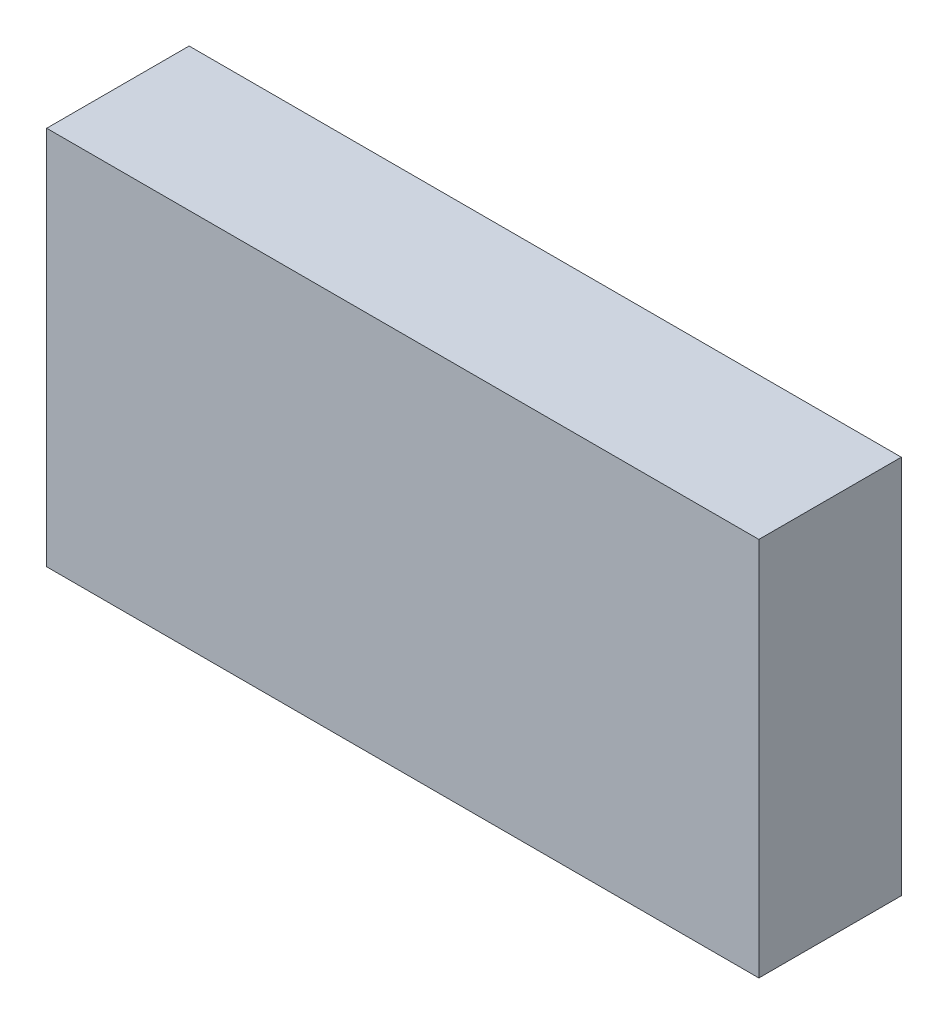
ISO-10303-21;
HEADER;
FILE_DESCRIPTION(('STEP AP214'),'2;1');
FILE_NAME('part.step','',(''),(''),'','','');
FILE_SCHEMA(('AUTOMOTIVE_DESIGN { 1 0 10303 214 1 1 1 1 }'));
ENDSEC;
DATA;
#1=APPLICATION_CONTEXT('core data for automotive mechanical design processes');
#2=APPLICATION_PROTOCOL_DEFINITION('international standard','automotive_design',2000,#1);
#3=PRODUCT_CONTEXT('',#1,'mechanical');
#4=PRODUCT('Part','Part','',(#3));
#5=PRODUCT_RELATED_PRODUCT_CATEGORY('part','',(#4));
#6=PRODUCT_DEFINITION_FORMATION('','',#4);
#7=PRODUCT_DEFINITION_CONTEXT('part definition',#1,'design');
#8=PRODUCT_DEFINITION('design','',#6,#7);
#9=PRODUCT_DEFINITION_SHAPE('','',#8);
#10=(LENGTH_UNIT() NAMED_UNIT(*) SI_UNIT(.MILLI.,.METRE.));
#11=(NAMED_UNIT(*) PLANE_ANGLE_UNIT() SI_UNIT($,.RADIAN.));
#12=(NAMED_UNIT(*) SI_UNIT($,.STERADIAN.) SOLID_ANGLE_UNIT());
#13=UNCERTAINTY_MEASURE_WITH_UNIT(LENGTH_MEASURE(1.E-05),#10,'distance_accuracy_value','');
#14=(GEOMETRIC_REPRESENTATION_CONTEXT(3) GLOBAL_UNCERTAINTY_ASSIGNED_CONTEXT((#13)) GLOBAL_UNIT_ASSIGNED_CONTEXT((#10,
#11,#12)) REPRESENTATION_CONTEXT('',''));
#15=CARTESIAN_POINT('',(0.,0.,0.));
#16=DIRECTION('',(0.,0.,1.));
#17=DIRECTION('',(1.,0.,0.));
#18=AXIS2_PLACEMENT_3D('',#15,#16,#17);
#19=CARTESIAN_POINT('',(596.,73.,-3.));
#20=DIRECTION('',(-1.,0.,0.));
#21=DIRECTION('',(0.,0.,1.));
#22=AXIS2_PLACEMENT_3D('',#19,#20,#21);
#23=PLANE('',#22);
#24=DIRECTION('',(0.,-1.,0.));
#25=VECTOR('',#24,1.);
#26=CARTESIAN_POINT('',(596.,73.,0.));
#27=LINE('',#26,#25);
#28=CARTESIAN_POINT('',(596.,81.,0.));
#29=VERTEX_POINT('',#28);
#30=CARTESIAN_POINT('',(596.,73.,0.));
#31=VERTEX_POINT('',#30);
#32=EDGE_CURVE('E103',#29,#31,#27,.T.);
#33=ORIENTED_EDGE('',*,*,#32,.F.);
#34=DIRECTION('',(0.,0.,1.));
#35=VECTOR('',#34,1.);
#36=CARTESIAN_POINT('',(596.,81.,-3.));
#37=LINE('',#36,#35);
#38=CARTESIAN_POINT('',(596.,81.,-3.));
#39=VERTEX_POINT('',#38);
#40=EDGE_CURVE('E11',#39,#29,#37,.T.);
#41=ORIENTED_EDGE('',*,*,#40,.F.);
#42=DIRECTION('',(0.,-1.,0.));
#43=VECTOR('',#42,1.);
#44=CARTESIAN_POINT('',(596.,73.,-3.));
#45=LINE('',#44,#43);
#46=CARTESIAN_POINT('',(596.,73.,-3.));
#47=VERTEX_POINT('',#46);
#48=EDGE_CURVE('E97',#39,#47,#45,.T.);
#49=ORIENTED_EDGE('',*,*,#48,.T.);
#50=DIRECTION('',(0.,0.,1.));
#51=VECTOR('',#50,1.);
#52=CARTESIAN_POINT('',(596.,73.,-3.));
#53=LINE('',#52,#51);
#54=EDGE_CURVE('E42',#47,#31,#53,.T.);
#55=ORIENTED_EDGE('',*,*,#54,.T.);
#56=EDGE_LOOP('',(#33,#41,#49,#55));
#57=FACE_BOUND('',#56,.T.);
#58=ADVANCED_FACE('F39',(#57),#23,.T.);
#59=CARTESIAN_POINT('',(596.,81.,-3.));
#60=DIRECTION('',(0.,1.,0.));
#61=DIRECTION('',(0.,0.,1.));
#62=AXIS2_PLACEMENT_3D('',#59,#60,#61);
#63=PLANE('',#62);
#64=DIRECTION('',(-1.,0.,0.));
#65=VECTOR('',#64,1.);
#66=CARTESIAN_POINT('',(596.,81.,0.));
#67=LINE('',#66,#65);
#68=CARTESIAN_POINT('',(611.,81.,0.));
#69=VERTEX_POINT('',#68);
#70=EDGE_CURVE('E99',#69,#29,#67,.T.);
#71=ORIENTED_EDGE('',*,*,#70,.F.);
#72=DIRECTION('',(0.,0.,1.));
#73=VECTOR('',#72,1.);
#74=CARTESIAN_POINT('',(611.,81.,-3.));
#75=LINE('',#74,#73);
#76=CARTESIAN_POINT('',(611.,81.,-3.));
#77=VERTEX_POINT('',#76);
#78=EDGE_CURVE('E48',#77,#69,#75,.T.);
#79=ORIENTED_EDGE('',*,*,#78,.F.);
#80=DIRECTION('',(-1.,0.,0.));
#81=VECTOR('',#80,1.);
#82=CARTESIAN_POINT('',(596.,81.,-3.));
#83=LINE('',#82,#81);
#84=EDGE_CURVE('E94',#77,#39,#83,.T.);
#85=ORIENTED_EDGE('',*,*,#84,.T.);
#86=ORIENTED_EDGE('',*,*,#40,.T.);
#87=EDGE_LOOP('',(#71,#79,#85,#86));
#88=FACE_BOUND('',#87,.T.);
#89=ADVANCED_FACE('F113',(#88),#63,.T.);
#90=CARTESIAN_POINT('',(611.,73.,-3.));
#91=DIRECTION('',(1.,0.,0.));
#92=DIRECTION('',(0.,0.,-1.));
#93=AXIS2_PLACEMENT_3D('',#90,#91,#92);
#94=PLANE('',#93);
#95=DIRECTION('',(0.,1.,0.));
#96=VECTOR('',#95,1.);
#97=CARTESIAN_POINT('',(611.,73.,0.));
#98=LINE('',#97,#96);
#99=CARTESIAN_POINT('',(611.,73.,0.));
#100=VERTEX_POINT('',#99);
#101=EDGE_CURVE('E89',#100,#69,#98,.T.);
#102=ORIENTED_EDGE('',*,*,#101,.F.);
#103=DIRECTION('',(0.,0.,1.));
#104=VECTOR('',#103,1.);
#105=CARTESIAN_POINT('',(611.,73.,-3.));
#106=LINE('',#105,#104);
#107=CARTESIAN_POINT('',(611.,73.,-3.));
#108=VERTEX_POINT('',#107);
#109=EDGE_CURVE('E84',#108,#100,#106,.T.);
#110=ORIENTED_EDGE('',*,*,#109,.F.);
#111=DIRECTION('',(0.,1.,0.));
#112=VECTOR('',#111,1.);
#113=CARTESIAN_POINT('',(611.,73.,-3.));
#114=LINE('',#113,#112);
#115=EDGE_CURVE('E87',#108,#77,#114,.T.);
#116=ORIENTED_EDGE('',*,*,#115,.T.);
#117=ORIENTED_EDGE('',*,*,#78,.T.);
#118=EDGE_LOOP('',(#102,#110,#116,#117));
#119=FACE_BOUND('',#118,.T.);
#120=ADVANCED_FACE('F86',(#119),#94,.T.);
#121=CARTESIAN_POINT('',(596.,73.,-3.));
#122=DIRECTION('',(0.,-1.,0.));
#123=DIRECTION('',(0.,0.,-1.));
#124=AXIS2_PLACEMENT_3D('',#121,#122,#123);
#125=PLANE('',#124);
#126=DIRECTION('',(1.,0.,0.));
#127=VECTOR('',#126,1.);
#128=CARTESIAN_POINT('',(596.,73.,0.));
#129=LINE('',#128,#127);
#130=EDGE_CURVE('E106',#31,#100,#129,.T.);
#131=ORIENTED_EDGE('',*,*,#130,.F.);
#132=ORIENTED_EDGE('',*,*,#54,.F.);
#133=DIRECTION('',(1.,0.,0.));
#134=VECTOR('',#133,1.);
#135=CARTESIAN_POINT('',(596.,73.,-3.));
#136=LINE('',#135,#134);
#137=EDGE_CURVE('E93',#47,#108,#136,.T.);
#138=ORIENTED_EDGE('',*,*,#137,.T.);
#139=ORIENTED_EDGE('',*,*,#109,.T.);
#140=EDGE_LOOP('',(#131,#132,#138,#139));
#141=FACE_BOUND('',#140,.T.);
#142=ADVANCED_FACE('F96',(#141),#125,.T.);
#143=CARTESIAN_POINT('',(0.,0.,-3.));
#144=DIRECTION('',(0.,0.,-1.));
#145=DIRECTION('',(-1.,0.,0.));
#146=AXIS2_PLACEMENT_3D('',#143,#144,#145);
#147=PLANE('',#146);
#148=ORIENTED_EDGE('',*,*,#48,.F.);
#149=ORIENTED_EDGE('',*,*,#84,.F.);
#150=ORIENTED_EDGE('',*,*,#115,.F.);
#151=ORIENTED_EDGE('',*,*,#137,.F.);
#152=EDGE_LOOP('',(#148,#149,#150,#151));
#153=FACE_BOUND('',#152,.T.);
#154=ADVANCED_FACE('F92',(#153),#147,.T.);
#155=CARTESIAN_POINT('',(0.,0.,0.));
#156=DIRECTION('',(0.,0.,-1.));
#157=DIRECTION('',(-1.,0.,0.));
#158=AXIS2_PLACEMENT_3D('',#155,#156,#157);
#159=PLANE('',#158);
#160=ORIENTED_EDGE('',*,*,#32,.T.);
#161=ORIENTED_EDGE('',*,*,#130,.T.);
#162=ORIENTED_EDGE('',*,*,#101,.T.);
#163=ORIENTED_EDGE('',*,*,#70,.T.);
#164=EDGE_LOOP('',(#160,#161,#162,#163));
#165=FACE_BOUND('',#164,.T.);
#166=ADVANCED_FACE('F112',(#165),#159,.F.);
#167=CLOSED_SHELL('',(#58,#89,#120,#142,#154,#166));
#168=MANIFOLD_SOLID_BREP('B2',#167);
#169=ADVANCED_BREP_SHAPE_REPRESENTATION('',(#18,#168),#14);
#170=SHAPE_DEFINITION_REPRESENTATION(#9,#169);
ENDSEC;
END-ISO-10303-21;
